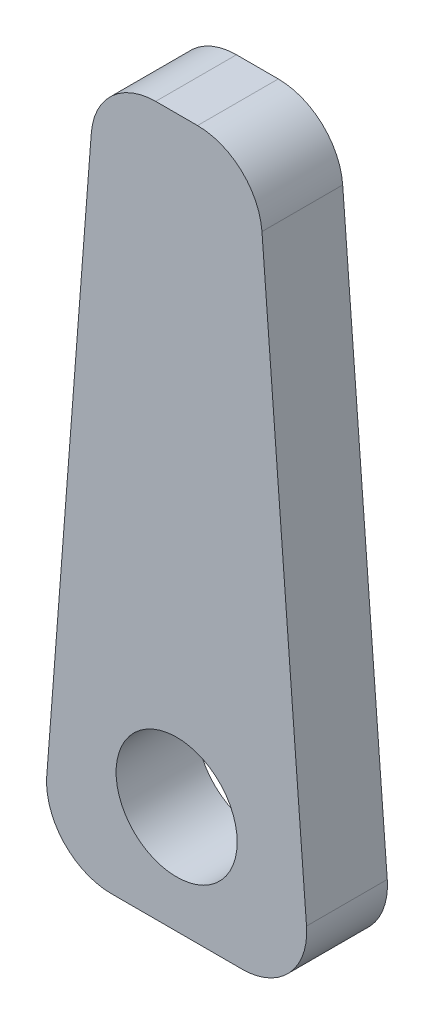
ISO-10303-21;
HEADER;
FILE_DESCRIPTION(('STEP AP214'),'2;1');
FILE_NAME('part.step','',(''),(''),'','','');
FILE_SCHEMA(('AUTOMOTIVE_DESIGN { 1 0 10303 214 1 1 1 1 }'));
ENDSEC;
DATA;
#1=APPLICATION_CONTEXT('core data for automotive mechanical design processes');
#2=APPLICATION_PROTOCOL_DEFINITION('international standard','automotive_design',2000,#1);
#3=PRODUCT_CONTEXT('',#1,'mechanical');
#4=PRODUCT('Part','Part','',(#3));
#5=PRODUCT_RELATED_PRODUCT_CATEGORY('part','',(#4));
#6=PRODUCT_DEFINITION_FORMATION('','',#4);
#7=PRODUCT_DEFINITION_CONTEXT('part definition',#1,'design');
#8=PRODUCT_DEFINITION('design','',#6,#7);
#9=PRODUCT_DEFINITION_SHAPE('','',#8);
#10=(LENGTH_UNIT() NAMED_UNIT(*) SI_UNIT(.MILLI.,.METRE.));
#11=(NAMED_UNIT(*) PLANE_ANGLE_UNIT() SI_UNIT($,.RADIAN.));
#12=(NAMED_UNIT(*) SI_UNIT($,.STERADIAN.) SOLID_ANGLE_UNIT());
#13=UNCERTAINTY_MEASURE_WITH_UNIT(LENGTH_MEASURE(1.E-05),#10,'distance_accuracy_value','');
#14=(GEOMETRIC_REPRESENTATION_CONTEXT(3) GLOBAL_UNCERTAINTY_ASSIGNED_CONTEXT((#13)) GLOBAL_UNIT_ASSIGNED_CONTEXT((#10,
#11,#12)) REPRESENTATION_CONTEXT('',''));
#15=CARTESIAN_POINT('',(0.,0.,0.));
#16=DIRECTION('',(0.,0.,1.));
#17=DIRECTION('',(1.,0.,0.));
#18=AXIS2_PLACEMENT_3D('',#15,#16,#17);
#19=CARTESIAN_POINT('',(-0.82288090627465,162.56,3.175));
#20=DIRECTION('',(0.,0.,-1.));
#21=DIRECTION('',(-1.,0.,0.));
#22=AXIS2_PLACEMENT_3D('',#19,#20,#21);
#23=CYLINDRICAL_SURFACE('',#22,2.53999999999999);
#24=CARTESIAN_POINT('',(-0.82288090627465,162.56,0.));
#25=DIRECTION('',(0.,0.,1.));
#26=DIRECTION('',(1.,0.,0.));
#27=AXIS2_PLACEMENT_3D('',#24,#25,#26);
#28=CIRCLE('',#27,2.53999999999999);
#29=CARTESIAN_POINT('',(-3.35539929944867,162.754809107167,0.));
#30=VERTEX_POINT('',#29);
#31=CARTESIAN_POINT('',(-0.822880906274633,165.1,0.));
#32=VERTEX_POINT('',#31);
#33=EDGE_CURVE('E131',#30,#32,#28,.F.);
#34=ORIENTED_EDGE('',*,*,#33,.F.);
#35=DIRECTION('',(0.,0.,-1.));
#36=VECTOR('',#35,1.);
#37=CARTESIAN_POINT('',(-3.35539929944867,162.754809107167,3.175));
#38=LINE('',#37,#36);
#39=CARTESIAN_POINT('',(-3.35539929944867,162.754809107167,3.175));
#40=VERTEX_POINT('',#39);
#41=EDGE_CURVE('E11',#40,#30,#38,.T.);
#42=ORIENTED_EDGE('',*,*,#41,.F.);
#43=CARTESIAN_POINT('',(-0.82288090627465,162.56,3.175));
#44=DIRECTION('',(0.,0.,1.));
#45=DIRECTION('',(1.,0.,0.));
#46=AXIS2_PLACEMENT_3D('',#43,#44,#45);
#47=CIRCLE('',#46,2.53999999999999);
#48=CARTESIAN_POINT('',(-0.822880906274633,165.1,3.175));
#49=VERTEX_POINT('',#48);
#50=EDGE_CURVE('E281',#40,#49,#47,.F.);
#51=ORIENTED_EDGE('',*,*,#50,.T.);
#52=DIRECTION('',(0.,0.,-1.));
#53=VECTOR('',#52,1.);
#54=CARTESIAN_POINT('',(-0.822880906274633,165.1,3.175));
#55=LINE('',#54,#53);
#56=EDGE_CURVE('E52',#49,#32,#55,.T.);
#57=ORIENTED_EDGE('',*,*,#56,.T.);
#58=EDGE_LOOP('',(#34,#42,#51,#57));
#59=FACE_BOUND('',#58,.T.);
#60=ADVANCED_FACE('F35',(#59),#23,.T.);
#61=CARTESIAN_POINT('',(-15.7816176470588,1.21397058823529,3.175));
#62=DIRECTION('',(-0.997054485501582,0.0766964988847371,0.));
#63=DIRECTION('',(-0.0766964988847371,-0.997054485501582,0.));
#64=AXIS2_PLACEMENT_3D('',#61,#62,#63);
#65=PLANE('',#64);
#66=DIRECTION('',(0.0766964988847371,0.997054485501582,0.));
#67=VECTOR('',#66,1.);
#68=CARTESIAN_POINT('',(-15.7816176470588,1.21397058823529,0.));
#69=LINE('',#68,#67);
#70=CARTESIAN_POINT('',(-5.10734801739739,139.979475773834,0.));
#71=VERTEX_POINT('',#70);
#72=EDGE_CURVE('E133',#71,#30,#69,.T.);
#73=ORIENTED_EDGE('',*,*,#72,.F.);
#74=DIRECTION('',(0.,0.,-1.));
#75=VECTOR('',#74,1.);
#76=CARTESIAN_POINT('',(-5.10734801739739,139.979475773834,3.175));
#77=LINE('',#76,#75);
#78=CARTESIAN_POINT('',(-5.10734801739739,139.979475773834,3.175));
#79=VERTEX_POINT('',#78);
#80=EDGE_CURVE('E44',#79,#71,#77,.T.);
#81=ORIENTED_EDGE('',*,*,#80,.F.);
#82=DIRECTION('',(0.0766964988847371,0.997054485501582,0.));
#83=VECTOR('',#82,1.);
#84=CARTESIAN_POINT('',(-15.7816176470588,1.21397058823529,3.175));
#85=LINE('',#84,#83);
#86=EDGE_CURVE('E173',#79,#40,#85,.T.);
#87=ORIENTED_EDGE('',*,*,#86,.T.);
#88=ORIENTED_EDGE('',*,*,#41,.T.);
#89=EDGE_LOOP('',(#73,#81,#87,#88));
#90=FACE_BOUND('',#89,.T.);
#91=ADVANCED_FACE('F172',(#90),#65,.T.);
#92=CARTESIAN_POINT('',(-2.57482962422337,139.784666666667,3.175));
#93=DIRECTION('',(0.,0.,-1.));
#94=DIRECTION('',(-1.,0.,0.));
#95=AXIS2_PLACEMENT_3D('',#92,#93,#94);
#96=CYLINDRICAL_SURFACE('',#95,2.53999999999999);
#97=CARTESIAN_POINT('',(-2.57482962422337,139.784666666667,0.));
#98=DIRECTION('',(0.,0.,1.));
#99=DIRECTION('',(1.,0.,0.));
#100=AXIS2_PLACEMENT_3D('',#97,#98,#99);
#101=CIRCLE('',#100,2.53999999999999);
#102=CARTESIAN_POINT('',(-2.57482962422335,137.244666666667,0.));
#103=VERTEX_POINT('',#102);
#104=EDGE_CURVE('E136',#71,#103,#101,.T.);
#105=ORIENTED_EDGE('',*,*,#104,.T.);
#106=DIRECTION('',(0.,0.,-1.));
#107=VECTOR('',#106,1.);
#108=CARTESIAN_POINT('',(-2.57482962422335,137.244666666667,3.175));
#109=LINE('',#108,#107);
#110=CARTESIAN_POINT('',(-2.57482962422335,137.244666666667,3.175));
#111=VERTEX_POINT('',#110);
#112=EDGE_CURVE('E157',#111,#103,#109,.T.);
#113=ORIENTED_EDGE('',*,*,#112,.F.);
#114=CARTESIAN_POINT('',(-2.57482962422337,139.784666666667,3.175));
#115=DIRECTION('',(0.,0.,1.));
#116=DIRECTION('',(1.,0.,0.));
#117=AXIS2_PLACEMENT_3D('',#114,#115,#116);
#118=CIRCLE('',#117,2.53999999999999);
#119=EDGE_CURVE('E165',#79,#111,#118,.T.);
#120=ORIENTED_EDGE('',*,*,#119,.F.);
#121=ORIENTED_EDGE('',*,*,#80,.T.);
#122=EDGE_LOOP('',(#105,#113,#120,#121));
#123=FACE_BOUND('',#122,.T.);
#124=ADVANCED_FACE('F162',(#123),#96,.T.);
#125=CARTESIAN_POINT('',(0.,137.244666666667,3.175));
#126=DIRECTION('',(0.,1.,0.));
#127=DIRECTION('',(0.,0.,1.));
#128=AXIS2_PLACEMENT_3D('',#125,#126,#127);
#129=PLANE('',#128);
#130=DIRECTION('',(1.,0.,0.));
#131=VECTOR('',#130,1.);
#132=CARTESIAN_POINT('',(0.,137.244666666667,0.));
#133=LINE('',#132,#131);
#134=CARTESIAN_POINT('',(2.57482962422336,137.244666666667,0.));
#135=VERTEX_POINT('',#134);
#136=EDGE_CURVE('E139',#103,#135,#133,.T.);
#137=ORIENTED_EDGE('',*,*,#136,.T.);
#138=DIRECTION('',(0.,0.,-1.));
#139=VECTOR('',#138,1.);
#140=CARTESIAN_POINT('',(2.57482962422336,137.244666666667,3.175));
#141=LINE('',#140,#139);
#142=CARTESIAN_POINT('',(2.57482962422336,137.244666666667,3.175));
#143=VERTEX_POINT('',#142);
#144=EDGE_CURVE('E155',#143,#135,#141,.T.);
#145=ORIENTED_EDGE('',*,*,#144,.F.);
#146=DIRECTION('',(1.,0.,0.));
#147=VECTOR('',#146,1.);
#148=CARTESIAN_POINT('',(0.,137.244666666667,3.175));
#149=LINE('',#148,#147);
#150=EDGE_CURVE('E278',#111,#143,#149,.T.);
#151=ORIENTED_EDGE('',*,*,#150,.F.);
#152=ORIENTED_EDGE('',*,*,#112,.T.);
#153=EDGE_LOOP('',(#137,#145,#151,#152));
#154=FACE_BOUND('',#153,.T.);
#155=ADVANCED_FACE('F194',(#154),#129,.F.);
#156=CARTESIAN_POINT('',(2.57482962422338,139.784666666667,3.175));
#157=DIRECTION('',(0.,0.,-1.));
#158=DIRECTION('',(-1.,0.,0.));
#159=AXIS2_PLACEMENT_3D('',#156,#157,#158);
#160=CYLINDRICAL_SURFACE('',#159,2.53999999999999);
#161=CARTESIAN_POINT('',(2.57482962422338,139.784666666667,0.));
#162=DIRECTION('',(0.,0.,1.));
#163=DIRECTION('',(1.,0.,0.));
#164=AXIS2_PLACEMENT_3D('',#161,#162,#163);
#165=CIRCLE('',#164,2.53999999999999);
#166=CARTESIAN_POINT('',(5.1073480173974,139.979475773834,0.));
#167=VERTEX_POINT('',#166);
#168=EDGE_CURVE('E142',#167,#135,#165,.F.);
#169=ORIENTED_EDGE('',*,*,#168,.F.);
#170=DIRECTION('',(0.,0.,-1.));
#171=VECTOR('',#170,1.);
#172=CARTESIAN_POINT('',(5.1073480173974,139.979475773834,3.175));
#173=LINE('',#172,#171);
#174=CARTESIAN_POINT('',(5.1073480173974,139.979475773834,3.175));
#175=VERTEX_POINT('',#174);
#176=EDGE_CURVE('E111',#175,#167,#173,.T.);
#177=ORIENTED_EDGE('',*,*,#176,.F.);
#178=CARTESIAN_POINT('',(2.57482962422338,139.784666666667,3.175));
#179=DIRECTION('',(0.,0.,1.));
#180=DIRECTION('',(1.,0.,0.));
#181=AXIS2_PLACEMENT_3D('',#178,#179,#180);
#182=CIRCLE('',#181,2.53999999999999);
#183=EDGE_CURVE('E120',#175,#143,#182,.F.);
#184=ORIENTED_EDGE('',*,*,#183,.T.);
#185=ORIENTED_EDGE('',*,*,#144,.T.);
#186=EDGE_LOOP('',(#169,#177,#184,#185));
#187=FACE_BOUND('',#186,.T.);
#188=ADVANCED_FACE('F197',(#187),#160,.T.);
#189=CARTESIAN_POINT('',(15.7816176470588,1.21397058823529,3.175));
#190=DIRECTION('',(0.997054485501582,0.076696498884737,0.));
#191=DIRECTION('',(-0.076696498884737,0.997054485501582,0.));
#192=AXIS2_PLACEMENT_3D('',#189,#190,#191);
#193=PLANE('',#192);
#194=DIRECTION('',(0.076696498884737,-0.997054485501582,0.));
#195=VECTOR('',#194,1.);
#196=CARTESIAN_POINT('',(15.7816176470588,1.21397058823529,0.));
#197=LINE('',#196,#195);
#198=CARTESIAN_POINT('',(3.35539929944868,162.754809107167,0.));
#199=VERTEX_POINT('',#198);
#200=EDGE_CURVE('E107',#199,#167,#197,.T.);
#201=ORIENTED_EDGE('',*,*,#200,.F.);
#202=DIRECTION('',(0.,0.,-1.));
#203=VECTOR('',#202,1.);
#204=CARTESIAN_POINT('',(3.35539929944868,162.754809107167,3.175));
#205=LINE('',#204,#203);
#206=CARTESIAN_POINT('',(3.35539929944868,162.754809107167,3.175));
#207=VERTEX_POINT('',#206);
#208=EDGE_CURVE('E102',#207,#199,#205,.T.);
#209=ORIENTED_EDGE('',*,*,#208,.F.);
#210=DIRECTION('',(0.076696498884737,-0.997054485501582,0.));
#211=VECTOR('',#210,1.);
#212=CARTESIAN_POINT('',(15.7816176470588,1.21397058823529,3.175));
#213=LINE('',#212,#211);
#214=EDGE_CURVE('E105',#207,#175,#213,.T.);
#215=ORIENTED_EDGE('',*,*,#214,.T.);
#216=ORIENTED_EDGE('',*,*,#176,.T.);
#217=EDGE_LOOP('',(#201,#209,#215,#216));
#218=FACE_BOUND('',#217,.T.);
#219=ADVANCED_FACE('F104',(#218),#193,.T.);
#220=CARTESIAN_POINT('',(0.822880906274664,162.56,3.175));
#221=DIRECTION('',(0.,0.,-1.));
#222=DIRECTION('',(-1.,0.,0.));
#223=AXIS2_PLACEMENT_3D('',#220,#221,#222);
#224=CYLINDRICAL_SURFACE('',#223,2.53999999999999);
#225=CARTESIAN_POINT('',(0.822880906274664,162.56,0.));
#226=DIRECTION('',(0.,0.,1.));
#227=DIRECTION('',(1.,0.,0.));
#228=AXIS2_PLACEMENT_3D('',#225,#226,#227);
#229=CIRCLE('',#228,2.53999999999999);
#230=CARTESIAN_POINT('',(0.822880906274648,165.1,0.));
#231=VERTEX_POINT('',#230);
#232=EDGE_CURVE('E146',#231,#199,#229,.F.);
#233=ORIENTED_EDGE('',*,*,#232,.F.);
#234=DIRECTION('',(0.,0.,-1.));
#235=VECTOR('',#234,1.);
#236=CARTESIAN_POINT('',(0.822880906274648,165.1,3.175));
#237=LINE('',#236,#235);
#238=CARTESIAN_POINT('',(0.822880906274648,165.1,3.175));
#239=VERTEX_POINT('',#238);
#240=EDGE_CURVE('E77',#239,#231,#237,.T.);
#241=ORIENTED_EDGE('',*,*,#240,.F.);
#242=CARTESIAN_POINT('',(0.822880906274664,162.56,3.175));
#243=DIRECTION('',(0.,0.,1.));
#244=DIRECTION('',(1.,0.,0.));
#245=AXIS2_PLACEMENT_3D('',#242,#243,#244);
#246=CIRCLE('',#245,2.53999999999999);
#247=EDGE_CURVE('E118',#239,#207,#246,.F.);
#248=ORIENTED_EDGE('',*,*,#247,.T.);
#249=ORIENTED_EDGE('',*,*,#208,.T.);
#250=EDGE_LOOP('',(#233,#241,#248,#249));
#251=FACE_BOUND('',#250,.T.);
#252=ADVANCED_FACE('F122',(#251),#224,.T.);
#253=CARTESIAN_POINT('',(0.,141.478000084667,3.175));
#254=DIRECTION('',(0.,0.,-1.));
#255=DIRECTION('',(-1.,0.,0.));
#256=AXIS2_PLACEMENT_3D('',#253,#254,#255);
#257=CYLINDRICAL_SURFACE('',#256,2.38125);
#258=CARTESIAN_POINT('',(0.,141.478000084667,3.175));
#259=DIRECTION('',(0.,0.,1.));
#260=DIRECTION('',(1.,0.,0.));
#261=AXIS2_PLACEMENT_3D('',#258,#259,#260);
#262=CIRCLE('',#261,2.38125);
#263=CARTESIAN_POINT('',(2.38125,141.478000084667,3.175));
#264=VERTEX_POINT('',#263);
#265=EDGE_CURVE('E151',#264,#264,#262,.T.);
#266=ORIENTED_EDGE('',*,*,#265,.T.);
#267=EDGE_LOOP('',(#266));
#268=FACE_BOUND('',#267,.T.);
#269=CARTESIAN_POINT('',(0.,141.478000084667,0.));
#270=DIRECTION('',(0.,0.,1.));
#271=DIRECTION('',(1.,0.,0.));
#272=AXIS2_PLACEMENT_3D('',#269,#270,#271);
#273=CIRCLE('',#272,2.38125);
#274=CARTESIAN_POINT('',(2.38125,141.478000084667,0.));
#275=VERTEX_POINT('',#274);
#276=EDGE_CURVE('E128',#275,#275,#273,.T.);
#277=ORIENTED_EDGE('',*,*,#276,.F.);
#278=EDGE_LOOP('',(#277));
#279=FACE_BOUND('',#278,.T.);
#280=ADVANCED_FACE('F37',(#268,#279),#257,.F.);
#281=CARTESIAN_POINT('',(0.,165.1,3.175));
#282=DIRECTION('',(0.,1.,0.));
#283=DIRECTION('',(0.,0.,1.));
#284=AXIS2_PLACEMENT_3D('',#281,#282,#283);
#285=PLANE('',#284);
#286=DIRECTION('',(1.,0.,0.));
#287=VECTOR('',#286,1.);
#288=CARTESIAN_POINT('',(0.,165.1,0.));
#289=LINE('',#288,#287);
#290=EDGE_CURVE('E148',#32,#231,#289,.T.);
#291=ORIENTED_EDGE('',*,*,#290,.F.);
#292=ORIENTED_EDGE('',*,*,#56,.F.);
#293=DIRECTION('',(1.,0.,0.));
#294=VECTOR('',#293,1.);
#295=CARTESIAN_POINT('',(0.,165.1,3.175));
#296=LINE('',#295,#294);
#297=EDGE_CURVE('E123',#49,#239,#296,.T.);
#298=ORIENTED_EDGE('',*,*,#297,.T.);
#299=ORIENTED_EDGE('',*,*,#240,.T.);
#300=EDGE_LOOP('',(#291,#292,#298,#299));
#301=FACE_BOUND('',#300,.T.);
#302=ADVANCED_FACE('F174',(#301),#285,.T.);
#303=CARTESIAN_POINT('',(0.,0.,3.175));
#304=DIRECTION('',(0.,0.,1.));
#305=DIRECTION('',(1.,0.,0.));
#306=AXIS2_PLACEMENT_3D('',#303,#304,#305);
#307=PLANE('',#306);
#308=ORIENTED_EDGE('',*,*,#265,.F.);
#309=EDGE_LOOP('',(#308));
#310=FACE_BOUND('',#309,.T.);
#311=ORIENTED_EDGE('',*,*,#50,.F.);
#312=ORIENTED_EDGE('',*,*,#86,.F.);
#313=ORIENTED_EDGE('',*,*,#119,.T.);
#314=ORIENTED_EDGE('',*,*,#150,.T.);
#315=ORIENTED_EDGE('',*,*,#183,.F.);
#316=ORIENTED_EDGE('',*,*,#214,.F.);
#317=ORIENTED_EDGE('',*,*,#247,.F.);
#318=ORIENTED_EDGE('',*,*,#297,.F.);
#319=EDGE_LOOP('',(#311,#312,#313,#314,#315,#316,#317,#318));
#320=FACE_BOUND('',#319,.T.);
#321=ADVANCED_FACE('F116',(#310,#320),#307,.T.);
#322=CARTESIAN_POINT('',(0.,0.,0.));
#323=DIRECTION('',(0.,0.,1.));
#324=DIRECTION('',(1.,0.,0.));
#325=AXIS2_PLACEMENT_3D('',#322,#323,#324);
#326=PLANE('',#325);
#327=ORIENTED_EDGE('',*,*,#276,.T.);
#328=EDGE_LOOP('',(#327));
#329=FACE_BOUND('',#328,.T.);
#330=ORIENTED_EDGE('',*,*,#33,.T.);
#331=ORIENTED_EDGE('',*,*,#290,.T.);
#332=ORIENTED_EDGE('',*,*,#232,.T.);
#333=ORIENTED_EDGE('',*,*,#200,.T.);
#334=ORIENTED_EDGE('',*,*,#168,.T.);
#335=ORIENTED_EDGE('',*,*,#136,.F.);
#336=ORIENTED_EDGE('',*,*,#104,.F.);
#337=ORIENTED_EDGE('',*,*,#72,.T.);
#338=EDGE_LOOP('',(#330,#331,#332,#333,#334,#335,#336,#337));
#339=FACE_BOUND('',#338,.T.);
#340=ADVANCED_FACE('F171',(#329,#339),#326,.F.);
#341=CLOSED_SHELL('',(#60,#91,#124,#155,#188,#219,#252,#280,#302,#321,#340));
#342=MANIFOLD_SOLID_BREP('B2',#341);
#343=ADVANCED_BREP_SHAPE_REPRESENTATION('',(#18,#342),#14);
#344=SHAPE_DEFINITION_REPRESENTATION(#9,#343);
ENDSEC;
END-ISO-10303-21;
